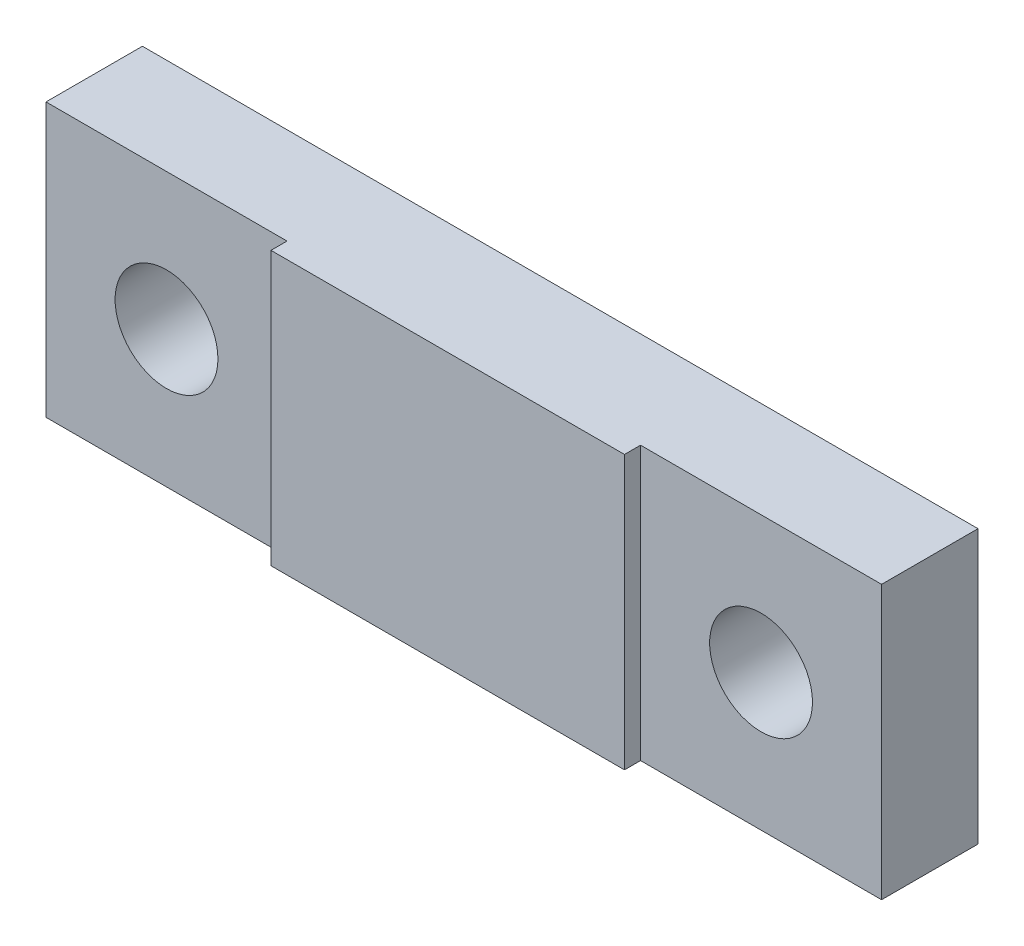
ISO-10303-21;
HEADER;
FILE_DESCRIPTION(('STEP AP214'),'2;1');
FILE_NAME('part.step','',(''),(''),'','','');
FILE_SCHEMA(('AUTOMOTIVE_DESIGN { 1 0 10303 214 1 1 1 1 }'));
ENDSEC;
DATA;
#1=APPLICATION_CONTEXT('core data for automotive mechanical design processes');
#2=APPLICATION_PROTOCOL_DEFINITION('international standard','automotive_design',2000,#1);
#3=PRODUCT_CONTEXT('',#1,'mechanical');
#4=PRODUCT('Part','Part','',(#3));
#5=PRODUCT_RELATED_PRODUCT_CATEGORY('part','',(#4));
#6=PRODUCT_DEFINITION_FORMATION('','',#4);
#7=PRODUCT_DEFINITION_CONTEXT('part definition',#1,'design');
#8=PRODUCT_DEFINITION('design','',#6,#7);
#9=PRODUCT_DEFINITION_SHAPE('','',#8);
#10=(LENGTH_UNIT() NAMED_UNIT(*) SI_UNIT(.MILLI.,.METRE.));
#11=(NAMED_UNIT(*) PLANE_ANGLE_UNIT() SI_UNIT($,.RADIAN.));
#12=(NAMED_UNIT(*) SI_UNIT($,.STERADIAN.) SOLID_ANGLE_UNIT());
#13=UNCERTAINTY_MEASURE_WITH_UNIT(LENGTH_MEASURE(1.E-05),#10,'distance_accuracy_value','');
#14=(GEOMETRIC_REPRESENTATION_CONTEXT(3) GLOBAL_UNCERTAINTY_ASSIGNED_CONTEXT((#13)) GLOBAL_UNIT_ASSIGNED_CONTEXT((#10,
#11,#12)) REPRESENTATION_CONTEXT('',''));
#15=CARTESIAN_POINT('',(0.,0.,0.));
#16=DIRECTION('',(0.,0.,1.));
#17=DIRECTION('',(1.,0.,0.));
#18=AXIS2_PLACEMENT_3D('',#15,#16,#17);
#19=CARTESIAN_POINT('',(0.,0.,3.));
#20=DIRECTION('',(0.,0.,1.));
#21=DIRECTION('',(1.,0.,0.));
#22=AXIS2_PLACEMENT_3D('',#19,#20,#21);
#23=PLANE('',#22);
#24=DIRECTION('',(0.,1.,0.));
#25=VECTOR('',#24,1.);
#26=CARTESIAN_POINT('',(18.5,-8.5,3.));
#27=LINE('',#26,#25);
#28=CARTESIAN_POINT('',(18.5,-8.5,3.));
#29=VERTEX_POINT('',#28);
#30=CARTESIAN_POINT('',(18.5,0.,3.));
#31=VERTEX_POINT('',#30);
#32=EDGE_CURVE('E121',#29,#31,#27,.T.);
#33=ORIENTED_EDGE('',*,*,#32,.F.);
#34=DIRECTION('',(1.,0.,0.));
#35=VECTOR('',#34,1.);
#36=CARTESIAN_POINT('',(0.,-8.5,3.));
#37=LINE('',#36,#35);
#38=CARTESIAN_POINT('',(26.,-8.5,3.));
#39=VERTEX_POINT('',#38);
#40=EDGE_CURVE('E143',#29,#39,#37,.T.);
#41=ORIENTED_EDGE('',*,*,#40,.T.);
#42=DIRECTION('',(0.,1.,0.));
#43=VECTOR('',#42,1.);
#44=CARTESIAN_POINT('',(26.,0.,3.));
#45=LINE('',#44,#43);
#46=CARTESIAN_POINT('',(26.,0.,3.));
#47=VERTEX_POINT('',#46);
#48=EDGE_CURVE('E147',#39,#47,#45,.T.);
#49=ORIENTED_EDGE('',*,*,#48,.T.);
#50=DIRECTION('',(-1.,0.,0.));
#51=VECTOR('',#50,1.);
#52=CARTESIAN_POINT('',(0.,0.,3.));
#53=LINE('',#52,#51);
#54=EDGE_CURVE('E58',#47,#31,#53,.T.);
#55=ORIENTED_EDGE('',*,*,#54,.T.);
#56=EDGE_LOOP('',(#33,#41,#49,#55));
#57=FACE_BOUND('',#56,.T.);
#58=CARTESIAN_POINT('',(22.25,-4.25,3.));
#59=DIRECTION('',(0.,0.,1.));
#60=DIRECTION('',(1.,0.,0.));
#61=AXIS2_PLACEMENT_3D('',#58,#59,#60);
#62=CIRCLE('',#61,1.6);
#63=CARTESIAN_POINT('',(23.85,-4.25,3.));
#64=VERTEX_POINT('',#63);
#65=EDGE_CURVE('E125',#64,#64,#62,.T.);
#66=ORIENTED_EDGE('',*,*,#65,.F.);
#67=EDGE_LOOP('',(#66));
#68=FACE_BOUND('',#67,.T.);
#69=ADVANCED_FACE('F35',(#57,#68),#23,.T.);
#70=DIRECTION('',(0.,-1.,0.));
#71=VECTOR('',#70,1.);
#72=CARTESIAN_POINT('',(7.5,-8.5,3.));
#73=LINE('',#72,#71);
#74=CARTESIAN_POINT('',(7.5,0.,3.));
#75=VERTEX_POINT('',#74);
#76=CARTESIAN_POINT('',(7.5,-8.5,3.));
#77=VERTEX_POINT('',#76);
#78=EDGE_CURVE('E50',#75,#77,#73,.T.);
#79=ORIENTED_EDGE('',*,*,#78,.F.);
#80=CARTESIAN_POINT('',(0.,0.,3.));
#81=VERTEX_POINT('',#80);
#82=EDGE_CURVE('E149',#75,#81,#53,.T.);
#83=ORIENTED_EDGE('',*,*,#82,.T.);
#84=DIRECTION('',(0.,-1.,0.));
#85=VECTOR('',#84,1.);
#86=CARTESIAN_POINT('',(0.,0.,3.));
#87=LINE('',#86,#85);
#88=CARTESIAN_POINT('',(0.,-8.5,3.));
#89=VERTEX_POINT('',#88);
#90=EDGE_CURVE('E140',#81,#89,#87,.T.);
#91=ORIENTED_EDGE('',*,*,#90,.T.);
#92=EDGE_CURVE('E145',#89,#77,#37,.T.);
#93=ORIENTED_EDGE('',*,*,#92,.T.);
#94=EDGE_LOOP('',(#79,#83,#91,#93));
#95=FACE_BOUND('',#94,.T.);
#96=CARTESIAN_POINT('',(3.75,-4.25,3.));
#97=DIRECTION('',(0.,0.,1.));
#98=DIRECTION('',(1.,0.,0.));
#99=AXIS2_PLACEMENT_3D('',#96,#97,#98);
#100=CIRCLE('',#99,1.6);
#101=CARTESIAN_POINT('',(5.35,-4.25,3.));
#102=VERTEX_POINT('',#101);
#103=EDGE_CURVE('E134',#102,#102,#100,.T.);
#104=ORIENTED_EDGE('',*,*,#103,.F.);
#105=EDGE_LOOP('',(#104));
#106=FACE_BOUND('',#105,.T.);
#107=ADVANCED_FACE('F181',(#95,#106),#23,.T.);
#108=CARTESIAN_POINT('',(0.,0.,0.));
#109=DIRECTION('',(0.,0.,1.));
#110=DIRECTION('',(1.,0.,0.));
#111=AXIS2_PLACEMENT_3D('',#108,#109,#110);
#112=PLANE('',#111);
#113=DIRECTION('',(0.,-1.,0.));
#114=VECTOR('',#113,1.);
#115=CARTESIAN_POINT('',(0.,0.,0.));
#116=LINE('',#115,#114);
#117=CARTESIAN_POINT('',(0.,0.,0.));
#118=VERTEX_POINT('',#117);
#119=CARTESIAN_POINT('',(0.,-8.5,0.));
#120=VERTEX_POINT('',#119);
#121=EDGE_CURVE('E137',#118,#120,#116,.T.);
#122=ORIENTED_EDGE('',*,*,#121,.F.);
#123=DIRECTION('',(-1.,0.,0.));
#124=VECTOR('',#123,1.);
#125=CARTESIAN_POINT('',(0.,0.,0.));
#126=LINE('',#125,#124);
#127=CARTESIAN_POINT('',(26.,0.,0.));
#128=VERTEX_POINT('',#127);
#129=EDGE_CURVE('E144',#128,#118,#126,.T.);
#130=ORIENTED_EDGE('',*,*,#129,.F.);
#131=DIRECTION('',(0.,1.,0.));
#132=VECTOR('',#131,1.);
#133=CARTESIAN_POINT('',(26.,0.,0.));
#134=LINE('',#133,#132);
#135=CARTESIAN_POINT('',(26.,-8.5,0.));
#136=VERTEX_POINT('',#135);
#137=EDGE_CURVE('E156',#136,#128,#134,.T.);
#138=ORIENTED_EDGE('',*,*,#137,.F.);
#139=DIRECTION('',(1.,0.,0.));
#140=VECTOR('',#139,1.);
#141=CARTESIAN_POINT('',(0.,-8.5,0.));
#142=LINE('',#141,#140);
#143=EDGE_CURVE('E154',#120,#136,#142,.T.);
#144=ORIENTED_EDGE('',*,*,#143,.F.);
#145=EDGE_LOOP('',(#122,#130,#138,#144));
#146=FACE_BOUND('',#145,.T.);
#147=CARTESIAN_POINT('',(3.75,-4.25,0.));
#148=DIRECTION('',(0.,0.,1.));
#149=DIRECTION('',(1.,0.,0.));
#150=AXIS2_PLACEMENT_3D('',#147,#148,#149);
#151=CIRCLE('',#150,1.6);
#152=CARTESIAN_POINT('',(5.35,-4.25,0.));
#153=VERTEX_POINT('',#152);
#154=EDGE_CURVE('E132',#153,#153,#151,.T.);
#155=ORIENTED_EDGE('',*,*,#154,.T.);
#156=EDGE_LOOP('',(#155));
#157=FACE_BOUND('',#156,.T.);
#158=CARTESIAN_POINT('',(22.25,-4.25,0.));
#159=DIRECTION('',(0.,0.,1.));
#160=DIRECTION('',(1.,0.,0.));
#161=AXIS2_PLACEMENT_3D('',#158,#159,#160);
#162=CIRCLE('',#161,1.6);
#163=CARTESIAN_POINT('',(23.85,-4.25,0.));
#164=VERTEX_POINT('',#163);
#165=EDGE_CURVE('E122',#164,#164,#162,.T.);
#166=ORIENTED_EDGE('',*,*,#165,.T.);
#167=EDGE_LOOP('',(#166));
#168=FACE_BOUND('',#167,.T.);
#169=ADVANCED_FACE('F175',(#146,#157,#168),#112,.F.);
#170=CARTESIAN_POINT('',(0.,0.,3.));
#171=DIRECTION('',(1.,0.,0.));
#172=DIRECTION('',(0.,1.,0.));
#173=AXIS2_PLACEMENT_3D('',#170,#171,#172);
#174=PLANE('',#173);
#175=ORIENTED_EDGE('',*,*,#121,.T.);
#176=DIRECTION('',(0.,0.,-1.));
#177=VECTOR('',#176,1.);
#178=CARTESIAN_POINT('',(0.,-8.5,3.));
#179=LINE('',#178,#177);
#180=EDGE_CURVE('E11',#89,#120,#179,.T.);
#181=ORIENTED_EDGE('',*,*,#180,.F.);
#182=ORIENTED_EDGE('',*,*,#90,.F.);
#183=DIRECTION('',(0.,0.,-1.));
#184=VECTOR('',#183,1.);
#185=CARTESIAN_POINT('',(0.,0.,3.));
#186=LINE('',#185,#184);
#187=EDGE_CURVE('E151',#81,#118,#186,.T.);
#188=ORIENTED_EDGE('',*,*,#187,.T.);
#189=EDGE_LOOP('',(#175,#181,#182,#188));
#190=FACE_BOUND('',#189,.T.);
#191=ADVANCED_FACE('F37',(#190),#174,.F.);
#192=CARTESIAN_POINT('',(0.,-8.5,3.));
#193=DIRECTION('',(0.,1.,0.));
#194=DIRECTION('',(0.,0.,1.));
#195=AXIS2_PLACEMENT_3D('',#192,#193,#194);
#196=PLANE('',#195);
#197=ORIENTED_EDGE('',*,*,#143,.T.);
#198=DIRECTION('',(0.,0.,-1.));
#199=VECTOR('',#198,1.);
#200=CARTESIAN_POINT('',(26.,-8.5,3.));
#201=LINE('',#200,#199);
#202=EDGE_CURVE('E43',#39,#136,#201,.T.);
#203=ORIENTED_EDGE('',*,*,#202,.F.);
#204=ORIENTED_EDGE('',*,*,#40,.F.);
#205=DIRECTION('',(0.,0.,-1.));
#206=VECTOR('',#205,1.);
#207=CARTESIAN_POINT('',(18.5,-8.5,3.5));
#208=LINE('',#207,#206);
#209=CARTESIAN_POINT('',(18.5,-8.5,3.5));
#210=VERTEX_POINT('',#209);
#211=EDGE_CURVE('E188',#210,#29,#208,.T.);
#212=ORIENTED_EDGE('',*,*,#211,.F.);
#213=DIRECTION('',(1.,0.,0.));
#214=VECTOR('',#213,1.);
#215=CARTESIAN_POINT('',(18.5,-8.5,3.5));
#216=LINE('',#215,#214);
#217=CARTESIAN_POINT('',(7.5,-8.5,3.5));
#218=VERTEX_POINT('',#217);
#219=EDGE_CURVE('E115',#218,#210,#216,.T.);
#220=ORIENTED_EDGE('',*,*,#219,.F.);
#221=DIRECTION('',(0.,0.,-1.));
#222=VECTOR('',#221,1.);
#223=CARTESIAN_POINT('',(7.5,-8.5,3.5));
#224=LINE('',#223,#222);
#225=EDGE_CURVE('E127',#218,#77,#224,.T.);
#226=ORIENTED_EDGE('',*,*,#225,.T.);
#227=ORIENTED_EDGE('',*,*,#92,.F.);
#228=ORIENTED_EDGE('',*,*,#180,.T.);
#229=EDGE_LOOP('',(#197,#203,#204,#212,#220,#226,#227,#228));
#230=FACE_BOUND('',#229,.T.);
#231=ADVANCED_FACE('F193',(#230),#196,.F.);
#232=CARTESIAN_POINT('',(26.,0.,3.));
#233=DIRECTION('',(-1.,0.,0.));
#234=DIRECTION('',(0.,0.,1.));
#235=AXIS2_PLACEMENT_3D('',#232,#233,#234);
#236=PLANE('',#235);
#237=ORIENTED_EDGE('',*,*,#137,.T.);
#238=DIRECTION('',(0.,0.,-1.));
#239=VECTOR('',#238,1.);
#240=CARTESIAN_POINT('',(26.,0.,3.));
#241=LINE('',#240,#239);
#242=EDGE_CURVE('E161',#47,#128,#241,.T.);
#243=ORIENTED_EDGE('',*,*,#242,.F.);
#244=ORIENTED_EDGE('',*,*,#48,.F.);
#245=ORIENTED_EDGE('',*,*,#202,.T.);
#246=EDGE_LOOP('',(#237,#243,#244,#245));
#247=FACE_BOUND('',#246,.T.);
#248=ADVANCED_FACE('F168',(#247),#236,.F.);
#249=CARTESIAN_POINT('',(0.,0.,3.));
#250=DIRECTION('',(0.,-1.,0.));
#251=DIRECTION('',(0.,0.,-1.));
#252=AXIS2_PLACEMENT_3D('',#249,#250,#251);
#253=PLANE('',#252);
#254=ORIENTED_EDGE('',*,*,#129,.T.);
#255=ORIENTED_EDGE('',*,*,#187,.F.);
#256=ORIENTED_EDGE('',*,*,#82,.F.);
#257=DIRECTION('',(0.,0.,-1.));
#258=VECTOR('',#257,1.);
#259=CARTESIAN_POINT('',(7.5,0.,3.5));
#260=LINE('',#259,#258);
#261=CARTESIAN_POINT('',(7.5,0.,3.5));
#262=VERTEX_POINT('',#261);
#263=EDGE_CURVE('E106',#262,#75,#260,.T.);
#264=ORIENTED_EDGE('',*,*,#263,.F.);
#265=DIRECTION('',(-1.,0.,0.));
#266=VECTOR('',#265,1.);
#267=CARTESIAN_POINT('',(18.5,0.,3.5));
#268=LINE('',#267,#266);
#269=CARTESIAN_POINT('',(18.5,0.,3.5));
#270=VERTEX_POINT('',#269);
#271=EDGE_CURVE('E99',#270,#262,#268,.T.);
#272=ORIENTED_EDGE('',*,*,#271,.F.);
#273=DIRECTION('',(0.,0.,-1.));
#274=VECTOR('',#273,1.);
#275=CARTESIAN_POINT('',(18.5,0.,3.5));
#276=LINE('',#275,#274);
#277=EDGE_CURVE('E103',#270,#31,#276,.T.);
#278=ORIENTED_EDGE('',*,*,#277,.T.);
#279=ORIENTED_EDGE('',*,*,#54,.F.);
#280=ORIENTED_EDGE('',*,*,#242,.T.);
#281=EDGE_LOOP('',(#254,#255,#256,#264,#272,#278,#279,#280));
#282=FACE_BOUND('',#281,.T.);
#283=ADVANCED_FACE('F101',(#282),#253,.F.);
#284=CARTESIAN_POINT('',(3.75,-4.25,3.));
#285=DIRECTION('',(0.,0.,-1.));
#286=DIRECTION('',(-1.,0.,0.));
#287=AXIS2_PLACEMENT_3D('',#284,#285,#286);
#288=CYLINDRICAL_SURFACE('',#287,1.6);
#289=ORIENTED_EDGE('',*,*,#103,.T.);
#290=EDGE_LOOP('',(#289));
#291=FACE_BOUND('',#290,.T.);
#292=ORIENTED_EDGE('',*,*,#154,.F.);
#293=EDGE_LOOP('',(#292));
#294=FACE_BOUND('',#293,.T.);
#295=ADVANCED_FACE('F202',(#291,#294),#288,.F.);
#296=CARTESIAN_POINT('',(22.25,-4.25,3.));
#297=DIRECTION('',(0.,0.,-1.));
#298=DIRECTION('',(-1.,0.,0.));
#299=AXIS2_PLACEMENT_3D('',#296,#297,#298);
#300=CYLINDRICAL_SURFACE('',#299,1.6);
#301=ORIENTED_EDGE('',*,*,#65,.T.);
#302=EDGE_LOOP('',(#301));
#303=FACE_BOUND('',#302,.T.);
#304=ORIENTED_EDGE('',*,*,#165,.F.);
#305=EDGE_LOOP('',(#304));
#306=FACE_BOUND('',#305,.T.);
#307=ADVANCED_FACE('F199',(#303,#306),#300,.F.);
#308=CARTESIAN_POINT('',(18.5,-8.5,3.5));
#309=DIRECTION('',(-1.,0.,0.));
#310=DIRECTION('',(0.,-1.,0.));
#311=AXIS2_PLACEMENT_3D('',#308,#309,#310);
#312=PLANE('',#311);
#313=ORIENTED_EDGE('',*,*,#32,.T.);
#314=ORIENTED_EDGE('',*,*,#277,.F.);
#315=DIRECTION('',(0.,1.,0.));
#316=VECTOR('',#315,1.);
#317=CARTESIAN_POINT('',(18.5,-8.5,3.5));
#318=LINE('',#317,#316);
#319=EDGE_CURVE('E110',#210,#270,#318,.T.);
#320=ORIENTED_EDGE('',*,*,#319,.F.);
#321=ORIENTED_EDGE('',*,*,#211,.T.);
#322=EDGE_LOOP('',(#313,#314,#320,#321));
#323=FACE_BOUND('',#322,.T.);
#324=ADVANCED_FACE('F120',(#323),#312,.F.);
#325=CARTESIAN_POINT('',(7.5,-8.5,3.5));
#326=DIRECTION('',(1.,0.,0.));
#327=DIRECTION('',(0.,1.,0.));
#328=AXIS2_PLACEMENT_3D('',#325,#326,#327);
#329=PLANE('',#328);
#330=ORIENTED_EDGE('',*,*,#78,.T.);
#331=ORIENTED_EDGE('',*,*,#225,.F.);
#332=DIRECTION('',(0.,-1.,0.));
#333=VECTOR('',#332,1.);
#334=CARTESIAN_POINT('',(7.5,-8.5,3.5));
#335=LINE('',#334,#333);
#336=EDGE_CURVE('E109',#262,#218,#335,.T.);
#337=ORIENTED_EDGE('',*,*,#336,.F.);
#338=ORIENTED_EDGE('',*,*,#263,.T.);
#339=EDGE_LOOP('',(#330,#331,#337,#338));
#340=FACE_BOUND('',#339,.T.);
#341=ADVANCED_FACE('F184',(#340),#329,.F.);
#342=CARTESIAN_POINT('',(0.,0.,3.5));
#343=DIRECTION('',(0.,0.,1.));
#344=DIRECTION('',(1.,0.,0.));
#345=AXIS2_PLACEMENT_3D('',#342,#343,#344);
#346=PLANE('',#345);
#347=ORIENTED_EDGE('',*,*,#319,.T.);
#348=ORIENTED_EDGE('',*,*,#271,.T.);
#349=ORIENTED_EDGE('',*,*,#336,.T.);
#350=ORIENTED_EDGE('',*,*,#219,.T.);
#351=EDGE_LOOP('',(#347,#348,#349,#350));
#352=FACE_BOUND('',#351,.T.);
#353=ADVANCED_FACE('F113',(#352),#346,.T.);
#354=CLOSED_SHELL('',(#69,#107,#169,#191,#231,#248,#283,#295,#307,#324,#341,#353));
#355=MANIFOLD_SOLID_BREP('B2',#354);
#356=ADVANCED_BREP_SHAPE_REPRESENTATION('',(#18,#355),#14);
#357=SHAPE_DEFINITION_REPRESENTATION(#9,#356);
ENDSEC;
END-ISO-10303-21;
